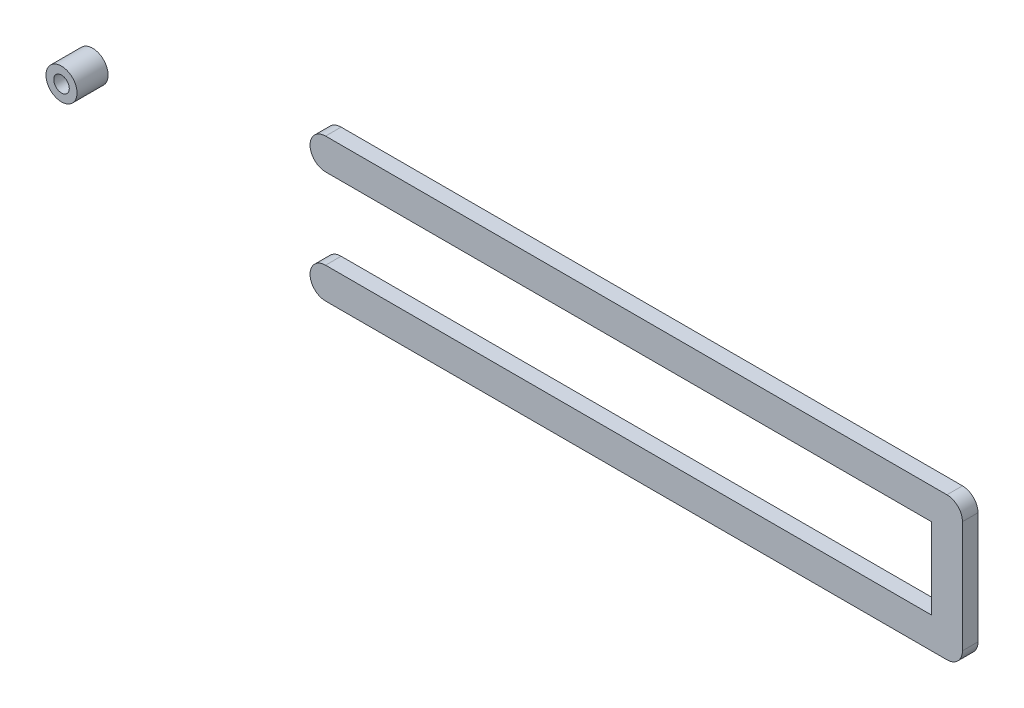
ISO-10303-21;
HEADER;
FILE_DESCRIPTION(('STEP AP214'),'2;1');
FILE_NAME('part.step','',(''),(''),'','','');
FILE_SCHEMA(('AUTOMOTIVE_DESIGN { 1 0 10303 214 1 1 1 1 }'));
ENDSEC;
DATA;
#1=APPLICATION_CONTEXT('core data for automotive mechanical design processes');
#2=APPLICATION_PROTOCOL_DEFINITION('international standard','automotive_design',2000,#1);
#3=PRODUCT_CONTEXT('',#1,'mechanical');
#4=PRODUCT('Part','Part','',(#3));
#5=PRODUCT_RELATED_PRODUCT_CATEGORY('part','',(#4));
#6=PRODUCT_DEFINITION_FORMATION('','',#4);
#7=PRODUCT_DEFINITION_CONTEXT('part definition',#1,'design');
#8=PRODUCT_DEFINITION('design','',#6,#7);
#9=PRODUCT_DEFINITION_SHAPE('','',#8);
#10=(LENGTH_UNIT() NAMED_UNIT(*) SI_UNIT(.MILLI.,.METRE.));
#11=(NAMED_UNIT(*) PLANE_ANGLE_UNIT() SI_UNIT($,.RADIAN.));
#12=(NAMED_UNIT(*) SI_UNIT($,.STERADIAN.) SOLID_ANGLE_UNIT());
#13=UNCERTAINTY_MEASURE_WITH_UNIT(LENGTH_MEASURE(1.E-05),#10,'distance_accuracy_value','');
#14=(GEOMETRIC_REPRESENTATION_CONTEXT(3) GLOBAL_UNCERTAINTY_ASSIGNED_CONTEXT((#13)) GLOBAL_UNIT_ASSIGNED_CONTEXT((#10,
#11,#12)) REPRESENTATION_CONTEXT('',''));
#15=CARTESIAN_POINT('',(0.,0.,0.));
#16=DIRECTION('',(0.,0.,1.));
#17=DIRECTION('',(1.,0.,0.));
#18=AXIS2_PLACEMENT_3D('',#15,#16,#17);
#19=CARTESIAN_POINT('',(-150.,26.,20.));
#20=DIRECTION('',(0.,0.,-1.));
#21=DIRECTION('',(-1.,0.,0.));
#22=AXIS2_PLACEMENT_3D('',#19,#20,#21);
#23=CYLINDRICAL_SURFACE('',#22,4.99999999999999);
#24=CARTESIAN_POINT('',(-150.,26.,20.));
#25=DIRECTION('',(0.,0.,1.));
#26=DIRECTION('',(1.,0.,0.));
#27=AXIS2_PLACEMENT_3D('',#24,#25,#26);
#28=CIRCLE('',#27,4.99999999999999);
#29=CARTESIAN_POINT('',(-145.,26.,20.));
#30=VERTEX_POINT('',#29);
#31=EDGE_CURVE('E49',#30,#30,#28,.T.);
#32=ORIENTED_EDGE('',*,*,#31,.T.);
#33=EDGE_LOOP('',(#32));
#34=FACE_BOUND('',#33,.T.);
#35=CARTESIAN_POINT('',(-150.,26.,0.));
#36=DIRECTION('',(0.,0.,1.));
#37=DIRECTION('',(1.,0.,0.));
#38=AXIS2_PLACEMENT_3D('',#35,#36,#37);
#39=CIRCLE('',#38,4.99999999999999);
#40=CARTESIAN_POINT('',(-145.,26.,0.));
#41=VERTEX_POINT('',#40);
#42=EDGE_CURVE('E55',#41,#41,#39,.T.);
#43=ORIENTED_EDGE('',*,*,#42,.F.);
#44=EDGE_LOOP('',(#43));
#45=FACE_BOUND('',#44,.T.);
#46=ADVANCED_FACE('F42',(#34,#45),#23,.F.);
#47=CARTESIAN_POINT('',(-150.,26.,20.));
#48=DIRECTION('',(0.,0.,-1.));
#49=DIRECTION('',(-1.,0.,0.));
#50=AXIS2_PLACEMENT_3D('',#47,#48,#49);
#51=CYLINDRICAL_SURFACE('',#50,9.99999999999998);
#52=CARTESIAN_POINT('',(-150.,26.,20.));
#53=DIRECTION('',(0.,0.,1.));
#54=DIRECTION('',(1.,0.,0.));
#55=AXIS2_PLACEMENT_3D('',#52,#53,#54);
#56=CIRCLE('',#55,9.99999999999998);
#57=CARTESIAN_POINT('',(-140.,26.,20.));
#58=VERTEX_POINT('',#57);
#59=EDGE_CURVE('E11',#58,#58,#56,.T.);
#60=ORIENTED_EDGE('',*,*,#59,.F.);
#61=EDGE_LOOP('',(#60));
#62=FACE_BOUND('',#61,.T.);
#63=CARTESIAN_POINT('',(-150.,26.,0.));
#64=DIRECTION('',(0.,0.,1.));
#65=DIRECTION('',(1.,0.,0.));
#66=AXIS2_PLACEMENT_3D('',#63,#64,#65);
#67=CIRCLE('',#66,9.99999999999998);
#68=CARTESIAN_POINT('',(-140.,26.,0.));
#69=VERTEX_POINT('',#68);
#70=EDGE_CURVE('E45',#69,#69,#67,.T.);
#71=ORIENTED_EDGE('',*,*,#70,.T.);
#72=EDGE_LOOP('',(#71));
#73=FACE_BOUND('',#72,.T.);
#74=ADVANCED_FACE('F62',(#62,#73),#51,.T.);
#75=CARTESIAN_POINT('',(0.,0.,20.));
#76=DIRECTION('',(0.,0.,1.));
#77=DIRECTION('',(1.,0.,0.));
#78=AXIS2_PLACEMENT_3D('',#75,#76,#77);
#79=PLANE('',#78);
#80=ORIENTED_EDGE('',*,*,#31,.F.);
#81=EDGE_LOOP('',(#80));
#82=FACE_BOUND('',#81,.T.);
#83=ORIENTED_EDGE('',*,*,#59,.T.);
#84=EDGE_LOOP('',(#83));
#85=FACE_BOUND('',#84,.T.);
#86=ADVANCED_FACE('F66',(#82,#85),#79,.T.);
#87=CARTESIAN_POINT('',(0.,0.,0.));
#88=DIRECTION('',(0.,0.,1.));
#89=DIRECTION('',(1.,0.,0.));
#90=AXIS2_PLACEMENT_3D('',#87,#88,#89);
#91=PLANE('',#90);
#92=ORIENTED_EDGE('',*,*,#42,.T.);
#93=EDGE_LOOP('',(#92));
#94=FACE_BOUND('',#93,.T.);
#95=ORIENTED_EDGE('',*,*,#70,.F.);
#96=EDGE_LOOP('',(#95));
#97=FACE_BOUND('',#96,.T.);
#98=ADVANCED_FACE('F64',(#94,#97),#91,.F.);
#99=CLOSED_SHELL('',(#46,#74,#86,#98));
#100=MANIFOLD_SOLID_BREP('B2',#99);
#101=CARTESIAN_POINT('',(0.,-20.,10.));
#102=DIRECTION('',(0.,-1.,0.));
#103=DIRECTION('',(1.,0.,0.));
#104=AXIS2_PLACEMENT_3D('',#101,#102,#103);
#105=PLANE('',#104);
#106=DIRECTION('',(-1.,0.,0.));
#107=VECTOR('',#106,1.);
#108=CARTESIAN_POINT('',(0.,-20.,0.));
#109=LINE('',#108,#107);
#110=CARTESIAN_POINT('',(410.,-20.,0.));
#111=VERTEX_POINT('',#110);
#112=CARTESIAN_POINT('',(10.,-20.,0.));
#113=VERTEX_POINT('',#112);
#114=EDGE_CURVE('E221',#111,#113,#109,.T.);
#115=ORIENTED_EDGE('',*,*,#114,.F.);
#116=DIRECTION('',(0.,0.,-1.));
#117=VECTOR('',#116,1.);
#118=CARTESIAN_POINT('',(410.,-20.,10.));
#119=LINE('',#118,#117);
#120=CARTESIAN_POINT('',(410.,-20.,10.));
#121=VERTEX_POINT('',#120);
#122=EDGE_CURVE('E257',#111,#121,#119,.F.);
#123=ORIENTED_EDGE('',*,*,#122,.T.);
#124=DIRECTION('',(-1.,0.,0.));
#125=VECTOR('',#124,1.);
#126=CARTESIAN_POINT('',(0.,-20.,10.));
#127=LINE('',#126,#125);
#128=CARTESIAN_POINT('',(10.,-20.,10.));
#129=VERTEX_POINT('',#128);
#130=EDGE_CURVE('E236',#121,#129,#127,.T.);
#131=ORIENTED_EDGE('',*,*,#130,.T.);
#132=DIRECTION('',(0.,0.,-1.));
#133=VECTOR('',#132,1.);
#134=CARTESIAN_POINT('',(10.,-20.,10.));
#135=LINE('',#134,#133);
#136=EDGE_CURVE('E254',#129,#113,#135,.T.);
#137=ORIENTED_EDGE('',*,*,#136,.T.);
#138=EDGE_LOOP('',(#115,#123,#131,#137));
#139=FACE_BOUND('',#138,.T.);
#140=ADVANCED_FACE('F103',(#139),#105,.T.);
#141=CARTESIAN_POINT('',(420.,0.,10.));
#142=DIRECTION('',(1.,0.,0.));
#143=DIRECTION('',(0.,0.,-1.));
#144=AXIS2_PLACEMENT_3D('',#141,#142,#143);
#145=PLANE('',#144);
#146=DIRECTION('',(0.,-1.,0.));
#147=VECTOR('',#146,1.);
#148=CARTESIAN_POINT('',(420.,0.,10.));
#149=LINE('',#148,#147);
#150=CARTESIAN_POINT('',(420.,62.,10.));
#151=VERTEX_POINT('',#150);
#152=CARTESIAN_POINT('',(420.,-9.99999999999995,10.));
#153=VERTEX_POINT('',#152);
#154=EDGE_CURVE('E305',#151,#153,#149,.T.);
#155=ORIENTED_EDGE('',*,*,#154,.T.);
#156=DIRECTION('',(0.,0.,-1.));
#157=VECTOR('',#156,1.);
#158=CARTESIAN_POINT('',(420.,-9.99999999999995,10.));
#159=LINE('',#158,#157);
#160=CARTESIAN_POINT('',(420.,-9.99999999999995,0.));
#161=VERTEX_POINT('',#160);
#162=EDGE_CURVE('E239',#153,#161,#159,.T.);
#163=ORIENTED_EDGE('',*,*,#162,.T.);
#164=DIRECTION('',(0.,-1.,0.));
#165=VECTOR('',#164,1.);
#166=CARTESIAN_POINT('',(420.,0.,0.));
#167=LINE('',#166,#165);
#168=CARTESIAN_POINT('',(420.,62.,0.));
#169=VERTEX_POINT('',#168);
#170=EDGE_CURVE('E224',#169,#161,#167,.T.);
#171=ORIENTED_EDGE('',*,*,#170,.F.);
#172=DIRECTION('',(0.,0.,-1.));
#173=VECTOR('',#172,1.);
#174=CARTESIAN_POINT('',(420.,62.,10.));
#175=LINE('',#174,#173);
#176=EDGE_CURVE('E204',#169,#151,#175,.F.);
#177=ORIENTED_EDGE('',*,*,#176,.T.);
#178=EDGE_LOOP('',(#155,#163,#171,#177));
#179=FACE_BOUND('',#178,.T.);
#180=ADVANCED_FACE('F302',(#179),#145,.T.);
#181=CARTESIAN_POINT('',(0.,72.,10.));
#182=DIRECTION('',(0.,1.,0.));
#183=DIRECTION('',(0.,0.,1.));
#184=AXIS2_PLACEMENT_3D('',#181,#182,#183);
#185=PLANE('',#184);
#186=DIRECTION('',(1.,0.,0.));
#187=VECTOR('',#186,1.);
#188=CARTESIAN_POINT('',(0.,72.,10.));
#189=LINE('',#188,#187);
#190=CARTESIAN_POINT('',(10.,72.,10.));
#191=VERTEX_POINT('',#190);
#192=CARTESIAN_POINT('',(410.,72.,10.));
#193=VERTEX_POINT('',#192);
#194=EDGE_CURVE('E211',#191,#193,#189,.T.);
#195=ORIENTED_EDGE('',*,*,#194,.T.);
#196=DIRECTION('',(0.,0.,-1.));
#197=VECTOR('',#196,1.);
#198=CARTESIAN_POINT('',(410.,72.,10.));
#199=LINE('',#198,#197);
#200=CARTESIAN_POINT('',(410.,72.,0.));
#201=VERTEX_POINT('',#200);
#202=EDGE_CURVE('E272',#193,#201,#199,.T.);
#203=ORIENTED_EDGE('',*,*,#202,.T.);
#204=DIRECTION('',(1.,0.,0.));
#205=VECTOR('',#204,1.);
#206=CARTESIAN_POINT('',(0.,72.,0.));
#207=LINE('',#206,#205);
#208=CARTESIAN_POINT('',(10.,72.,0.));
#209=VERTEX_POINT('',#208);
#210=EDGE_CURVE('E228',#209,#201,#207,.T.);
#211=ORIENTED_EDGE('',*,*,#210,.F.);
#212=DIRECTION('',(0.,0.,-1.));
#213=VECTOR('',#212,1.);
#214=CARTESIAN_POINT('',(10.,72.,10.));
#215=LINE('',#214,#213);
#216=EDGE_CURVE('E270',#209,#191,#215,.F.);
#217=ORIENTED_EDGE('',*,*,#216,.T.);
#218=EDGE_LOOP('',(#195,#203,#211,#217));
#219=FACE_BOUND('',#218,.T.);
#220=ADVANCED_FACE('F292',(#219),#185,.T.);
#221=CARTESIAN_POINT('',(0.,51.9999999999999,10.));
#222=DIRECTION('',(0.,-1.,0.));
#223=DIRECTION('',(1.,0.,0.));
#224=AXIS2_PLACEMENT_3D('',#221,#222,#223);
#225=PLANE('',#224);
#226=DIRECTION('',(-1.,0.,0.));
#227=VECTOR('',#226,1.);
#228=CARTESIAN_POINT('',(0.,51.9999999999999,10.));
#229=LINE('',#228,#227);
#230=CARTESIAN_POINT('',(400.,52.,10.));
#231=VERTEX_POINT('',#230);
#232=CARTESIAN_POINT('',(10.,51.9999999999999,10.));
#233=VERTEX_POINT('',#232);
#234=EDGE_CURVE('E196',#231,#233,#229,.T.);
#235=ORIENTED_EDGE('',*,*,#234,.T.);
#236=DIRECTION('',(0.,0.,-1.));
#237=VECTOR('',#236,1.);
#238=CARTESIAN_POINT('',(10.,51.9999999999999,10.));
#239=LINE('',#238,#237);
#240=CARTESIAN_POINT('',(10.,51.9999999999999,0.));
#241=VERTEX_POINT('',#240);
#242=EDGE_CURVE('E40',#233,#241,#239,.T.);
#243=ORIENTED_EDGE('',*,*,#242,.T.);
#244=DIRECTION('',(-1.,0.,0.));
#245=VECTOR('',#244,1.);
#246=CARTESIAN_POINT('',(0.,51.9999999999999,0.));
#247=LINE('',#246,#245);
#248=CARTESIAN_POINT('',(400.,52.,0.));
#249=VERTEX_POINT('',#248);
#250=EDGE_CURVE('E199',#249,#241,#247,.T.);
#251=ORIENTED_EDGE('',*,*,#250,.F.);
#252=DIRECTION('',(0.,0.,-1.));
#253=VECTOR('',#252,1.);
#254=CARTESIAN_POINT('',(400.,52.,10.));
#255=LINE('',#254,#253);
#256=EDGE_CURVE('E194',#231,#249,#255,.T.);
#257=ORIENTED_EDGE('',*,*,#256,.F.);
#258=EDGE_LOOP('',(#235,#243,#251,#257));
#259=FACE_BOUND('',#258,.T.);
#260=ADVANCED_FACE('F195',(#259),#225,.T.);
#261=CARTESIAN_POINT('',(400.,0.,10.));
#262=DIRECTION('',(-1.,0.,0.));
#263=DIRECTION('',(0.,0.,1.));
#264=AXIS2_PLACEMENT_3D('',#261,#262,#263);
#265=PLANE('',#264);
#266=DIRECTION('',(0.,1.,0.));
#267=VECTOR('',#266,1.);
#268=CARTESIAN_POINT('',(400.,0.,0.));
#269=LINE('',#268,#267);
#270=CARTESIAN_POINT('',(400.,0.,0.));
#271=VERTEX_POINT('',#270);
#272=EDGE_CURVE('E232',#271,#249,#269,.T.);
#273=ORIENTED_EDGE('',*,*,#272,.F.);
#274=DIRECTION('',(0.,0.,-1.));
#275=VECTOR('',#274,1.);
#276=CARTESIAN_POINT('',(400.,0.,10.));
#277=LINE('',#276,#275);
#278=CARTESIAN_POINT('',(400.,0.,10.));
#279=VERTEX_POINT('',#278);
#280=EDGE_CURVE('E205',#279,#271,#277,.T.);
#281=ORIENTED_EDGE('',*,*,#280,.F.);
#282=DIRECTION('',(0.,1.,0.));
#283=VECTOR('',#282,1.);
#284=CARTESIAN_POINT('',(400.,0.,10.));
#285=LINE('',#284,#283);
#286=EDGE_CURVE('E210',#279,#231,#285,.T.);
#287=ORIENTED_EDGE('',*,*,#286,.T.);
#288=ORIENTED_EDGE('',*,*,#256,.T.);
#289=EDGE_LOOP('',(#273,#281,#287,#288));
#290=FACE_BOUND('',#289,.T.);
#291=ADVANCED_FACE('F214',(#290),#265,.T.);
#292=CARTESIAN_POINT('',(0.,0.,10.));
#293=DIRECTION('',(0.,1.,0.));
#294=DIRECTION('',(0.,0.,1.));
#295=AXIS2_PLACEMENT_3D('',#292,#293,#294);
#296=PLANE('',#295);
#297=DIRECTION('',(1.,0.,0.));
#298=VECTOR('',#297,1.);
#299=CARTESIAN_POINT('',(0.,0.,0.));
#300=LINE('',#299,#298);
#301=CARTESIAN_POINT('',(10.,0.,0.));
#302=VERTEX_POINT('',#301);
#303=EDGE_CURVE('E234',#302,#271,#300,.T.);
#304=ORIENTED_EDGE('',*,*,#303,.F.);
#305=DIRECTION('',(0.,0.,-1.));
#306=VECTOR('',#305,1.);
#307=CARTESIAN_POINT('',(10.,0.,10.));
#308=LINE('',#307,#306);
#309=CARTESIAN_POINT('',(10.,0.,10.));
#310=VERTEX_POINT('',#309);
#311=EDGE_CURVE('E112',#302,#310,#308,.F.);
#312=ORIENTED_EDGE('',*,*,#311,.T.);
#313=DIRECTION('',(1.,0.,0.));
#314=VECTOR('',#313,1.);
#315=CARTESIAN_POINT('',(0.,0.,10.));
#316=LINE('',#315,#314);
#317=EDGE_CURVE('E216',#310,#279,#316,.T.);
#318=ORIENTED_EDGE('',*,*,#317,.T.);
#319=ORIENTED_EDGE('',*,*,#280,.T.);
#320=EDGE_LOOP('',(#304,#312,#318,#319));
#321=FACE_BOUND('',#320,.T.);
#322=ADVANCED_FACE('F319',(#321),#296,.T.);
#323=CARTESIAN_POINT('',(0.,0.,10.));
#324=DIRECTION('',(0.,0.,1.));
#325=DIRECTION('',(1.,0.,0.));
#326=AXIS2_PLACEMENT_3D('',#323,#324,#325);
#327=PLANE('',#326);
#328=ORIENTED_EDGE('',*,*,#130,.F.);
#329=CARTESIAN_POINT('',(410.,-9.99999999999995,10.));
#330=DIRECTION('',(0.,0.,1.));
#331=DIRECTION('',(1.,0.,0.));
#332=AXIS2_PLACEMENT_3D('',#329,#330,#331);
#333=CIRCLE('',#332,10.);
#334=EDGE_CURVE('E268',#121,#153,#333,.T.);
#335=ORIENTED_EDGE('',*,*,#334,.T.);
#336=ORIENTED_EDGE('',*,*,#154,.F.);
#337=CARTESIAN_POINT('',(410.,62.,10.));
#338=DIRECTION('',(0.,0.,1.));
#339=DIRECTION('',(1.,0.,0.));
#340=AXIS2_PLACEMENT_3D('',#337,#338,#339);
#341=CIRCLE('',#340,10.);
#342=EDGE_CURVE('E266',#151,#193,#341,.T.);
#343=ORIENTED_EDGE('',*,*,#342,.T.);
#344=ORIENTED_EDGE('',*,*,#194,.F.);
#345=CARTESIAN_POINT('',(10.,62.,10.));
#346=DIRECTION('',(0.,0.,1.));
#347=DIRECTION('',(1.,0.,0.));
#348=AXIS2_PLACEMENT_3D('',#345,#346,#347);
#349=CIRCLE('',#348,10.);
#350=CARTESIAN_POINT('',(0.,62.,10.));
#351=VERTEX_POINT('',#350);
#352=EDGE_CURVE('E259',#191,#351,#349,.T.);
#353=ORIENTED_EDGE('',*,*,#352,.T.);
#354=CARTESIAN_POINT('',(10.,61.9999999999999,10.));
#355=DIRECTION('',(0.,0.,1.));
#356=DIRECTION('',(1.,0.,0.));
#357=AXIS2_PLACEMENT_3D('',#354,#355,#356);
#358=CIRCLE('',#357,10.);
#359=EDGE_CURVE('E127',#351,#233,#358,.T.);
#360=ORIENTED_EDGE('',*,*,#359,.T.);
#361=ORIENTED_EDGE('',*,*,#234,.F.);
#362=ORIENTED_EDGE('',*,*,#286,.F.);
#363=ORIENTED_EDGE('',*,*,#317,.F.);
#364=CARTESIAN_POINT('',(10.,-10.,10.));
#365=DIRECTION('',(0.,0.,1.));
#366=DIRECTION('',(1.,0.,0.));
#367=AXIS2_PLACEMENT_3D('',#364,#365,#366);
#368=CIRCLE('',#367,10.);
#369=CARTESIAN_POINT('',(0.,-10.,10.));
#370=VERTEX_POINT('',#369);
#371=EDGE_CURVE('E262',#310,#370,#368,.T.);
#372=ORIENTED_EDGE('',*,*,#371,.T.);
#373=CARTESIAN_POINT('',(10.,-10.,10.));
#374=DIRECTION('',(0.,0.,1.));
#375=DIRECTION('',(1.,0.,0.));
#376=AXIS2_PLACEMENT_3D('',#373,#374,#375);
#377=CIRCLE('',#376,10.);
#378=EDGE_CURVE('E264',#370,#129,#377,.T.);
#379=ORIENTED_EDGE('',*,*,#378,.T.);
#380=EDGE_LOOP('',(#328,#335,#336,#343,#344,#353,#360,#361,#362,#363,#372,#379));
#381=FACE_BOUND('',#380,.T.);
#382=ADVANCED_FACE('F209',(#381),#327,.T.);
#383=CARTESIAN_POINT('',(0.,0.,0.));
#384=DIRECTION('',(0.,0.,1.));
#385=DIRECTION('',(1.,0.,0.));
#386=AXIS2_PLACEMENT_3D('',#383,#384,#385);
#387=PLANE('',#386);
#388=ORIENTED_EDGE('',*,*,#170,.T.);
#389=CARTESIAN_POINT('',(410.,-9.99999999999995,0.));
#390=DIRECTION('',(0.,0.,1.));
#391=DIRECTION('',(1.,0.,0.));
#392=AXIS2_PLACEMENT_3D('',#389,#390,#391);
#393=CIRCLE('',#392,10.);
#394=EDGE_CURVE('E252',#161,#111,#393,.F.);
#395=ORIENTED_EDGE('',*,*,#394,.T.);
#396=ORIENTED_EDGE('',*,*,#114,.T.);
#397=CARTESIAN_POINT('',(10.,-10.,0.));
#398=DIRECTION('',(0.,0.,1.));
#399=DIRECTION('',(1.,0.,0.));
#400=AXIS2_PLACEMENT_3D('',#397,#398,#399);
#401=CIRCLE('',#400,10.);
#402=CARTESIAN_POINT('',(0.,-10.,0.));
#403=VERTEX_POINT('',#402);
#404=EDGE_CURVE('E248',#113,#403,#401,.F.);
#405=ORIENTED_EDGE('',*,*,#404,.T.);
#406=CARTESIAN_POINT('',(10.,-10.,0.));
#407=DIRECTION('',(0.,0.,1.));
#408=DIRECTION('',(1.,0.,0.));
#409=AXIS2_PLACEMENT_3D('',#406,#407,#408);
#410=CIRCLE('',#409,10.);
#411=EDGE_CURVE('E246',#403,#302,#410,.F.);
#412=ORIENTED_EDGE('',*,*,#411,.T.);
#413=ORIENTED_EDGE('',*,*,#303,.T.);
#414=ORIENTED_EDGE('',*,*,#272,.T.);
#415=ORIENTED_EDGE('',*,*,#250,.T.);
#416=CARTESIAN_POINT('',(10.,61.9999999999999,0.));
#417=DIRECTION('',(0.,0.,1.));
#418=DIRECTION('',(1.,0.,0.));
#419=AXIS2_PLACEMENT_3D('',#416,#417,#418);
#420=CIRCLE('',#419,10.);
#421=CARTESIAN_POINT('',(0.,62.,0.));
#422=VERTEX_POINT('',#421);
#423=EDGE_CURVE('E244',#241,#422,#420,.F.);
#424=ORIENTED_EDGE('',*,*,#423,.T.);
#425=CARTESIAN_POINT('',(10.,62.,0.));
#426=DIRECTION('',(0.,0.,1.));
#427=DIRECTION('',(1.,0.,0.));
#428=AXIS2_PLACEMENT_3D('',#425,#426,#427);
#429=CIRCLE('',#428,10.);
#430=EDGE_CURVE('E242',#422,#209,#429,.F.);
#431=ORIENTED_EDGE('',*,*,#430,.T.);
#432=ORIENTED_EDGE('',*,*,#210,.T.);
#433=CARTESIAN_POINT('',(410.,62.,0.));
#434=DIRECTION('',(0.,0.,1.));
#435=DIRECTION('',(1.,0.,0.));
#436=AXIS2_PLACEMENT_3D('',#433,#434,#435);
#437=CIRCLE('',#436,10.);
#438=EDGE_CURVE('E250',#201,#169,#437,.F.);
#439=ORIENTED_EDGE('',*,*,#438,.T.);
#440=EDGE_LOOP('',(#388,#395,#396,#405,#412,#413,#414,#415,#424,#431,#432,#439));
#441=FACE_BOUND('',#440,.T.);
#442=ADVANCED_FACE('F289',(#441),#387,.F.);
#443=CARTESIAN_POINT('',(410.,-9.99999999999995,10.));
#444=DIRECTION('',(0.,0.,-1.));
#445=DIRECTION('',(-1.,0.,0.));
#446=AXIS2_PLACEMENT_3D('',#443,#444,#445);
#447=CYLINDRICAL_SURFACE('',#446,10.);
#448=ORIENTED_EDGE('',*,*,#334,.F.);
#449=ORIENTED_EDGE('',*,*,#122,.F.);
#450=ORIENTED_EDGE('',*,*,#394,.F.);
#451=ORIENTED_EDGE('',*,*,#162,.F.);
#452=EDGE_LOOP('',(#448,#449,#450,#451));
#453=FACE_BOUND('',#452,.T.);
#454=ADVANCED_FACE('F308',(#453),#447,.T.);
#455=CARTESIAN_POINT('',(410.,62.,10.));
#456=DIRECTION('',(0.,0.,-1.));
#457=DIRECTION('',(-1.,0.,0.));
#458=AXIS2_PLACEMENT_3D('',#455,#456,#457);
#459=CYLINDRICAL_SURFACE('',#458,10.);
#460=ORIENTED_EDGE('',*,*,#342,.F.);
#461=ORIENTED_EDGE('',*,*,#176,.F.);
#462=ORIENTED_EDGE('',*,*,#438,.F.);
#463=ORIENTED_EDGE('',*,*,#202,.F.);
#464=EDGE_LOOP('',(#460,#461,#462,#463));
#465=FACE_BOUND('',#464,.T.);
#466=ADVANCED_FACE('F297',(#465),#459,.T.);
#467=CARTESIAN_POINT('',(10.,-10.,10.));
#468=DIRECTION('',(0.,0.,-1.));
#469=DIRECTION('',(-1.,0.,0.));
#470=AXIS2_PLACEMENT_3D('',#467,#468,#469);
#471=CYLINDRICAL_SURFACE('',#470,10.);
#472=DIRECTION('',(0.,0.,-1.));
#473=VECTOR('',#472,1.);
#474=CARTESIAN_POINT('',(0.,-10.,10.));
#475=LINE('',#474,#473);
#476=EDGE_CURVE('E225',#370,#403,#475,.T.);
#477=ORIENTED_EDGE('',*,*,#476,.F.);
#478=ORIENTED_EDGE('',*,*,#371,.F.);
#479=ORIENTED_EDGE('',*,*,#311,.F.);
#480=ORIENTED_EDGE('',*,*,#411,.F.);
#481=EDGE_LOOP('',(#477,#478,#479,#480));
#482=FACE_BOUND('',#481,.T.);
#483=ADVANCED_FACE('F317',(#482),#471,.T.);
#484=CARTESIAN_POINT('',(10.,-10.,10.));
#485=DIRECTION('',(0.,0.,-1.));
#486=DIRECTION('',(-1.,0.,0.));
#487=AXIS2_PLACEMENT_3D('',#484,#485,#486);
#488=CYLINDRICAL_SURFACE('',#487,10.);
#489=ORIENTED_EDGE('',*,*,#378,.F.);
#490=ORIENTED_EDGE('',*,*,#476,.T.);
#491=ORIENTED_EDGE('',*,*,#404,.F.);
#492=ORIENTED_EDGE('',*,*,#136,.F.);
#493=EDGE_LOOP('',(#489,#490,#491,#492));
#494=FACE_BOUND('',#493,.T.);
#495=ADVANCED_FACE('F314',(#494),#488,.T.);
#496=CARTESIAN_POINT('',(10.,62.,10.));
#497=DIRECTION('',(0.,0.,-1.));
#498=DIRECTION('',(-1.,0.,0.));
#499=AXIS2_PLACEMENT_3D('',#496,#497,#498);
#500=CYLINDRICAL_SURFACE('',#499,10.);
#501=DIRECTION('',(0.,0.,-1.));
#502=VECTOR('',#501,1.);
#503=CARTESIAN_POINT('',(0.,62.,10.));
#504=LINE('',#503,#502);
#505=EDGE_CURVE('E107',#351,#422,#504,.T.);
#506=ORIENTED_EDGE('',*,*,#505,.F.);
#507=ORIENTED_EDGE('',*,*,#352,.F.);
#508=ORIENTED_EDGE('',*,*,#216,.F.);
#509=ORIENTED_EDGE('',*,*,#430,.F.);
#510=EDGE_LOOP('',(#506,#507,#508,#509));
#511=FACE_BOUND('',#510,.T.);
#512=ADVANCED_FACE('F105',(#511),#500,.T.);
#513=CARTESIAN_POINT('',(10.,61.9999999999999,10.));
#514=DIRECTION('',(0.,0.,-1.));
#515=DIRECTION('',(-1.,0.,0.));
#516=AXIS2_PLACEMENT_3D('',#513,#514,#515);
#517=CYLINDRICAL_SURFACE('',#516,10.);
#518=ORIENTED_EDGE('',*,*,#359,.F.);
#519=ORIENTED_EDGE('',*,*,#505,.T.);
#520=ORIENTED_EDGE('',*,*,#423,.F.);
#521=ORIENTED_EDGE('',*,*,#242,.F.);
#522=EDGE_LOOP('',(#518,#519,#520,#521));
#523=FACE_BOUND('',#522,.T.);
#524=ADVANCED_FACE('F282',(#523),#517,.T.);
#525=CLOSED_SHELL('',(#140,#180,#220,#260,#291,#322,#382,#442,#454,#466,#483,#495,#512,#524));
#526=MANIFOLD_SOLID_BREP('B6',#525);
#527=ADVANCED_BREP_SHAPE_REPRESENTATION('',(#18,#100,#526),#14);
#528=SHAPE_DEFINITION_REPRESENTATION(#9,#527);
ENDSEC;
END-ISO-10303-21;
